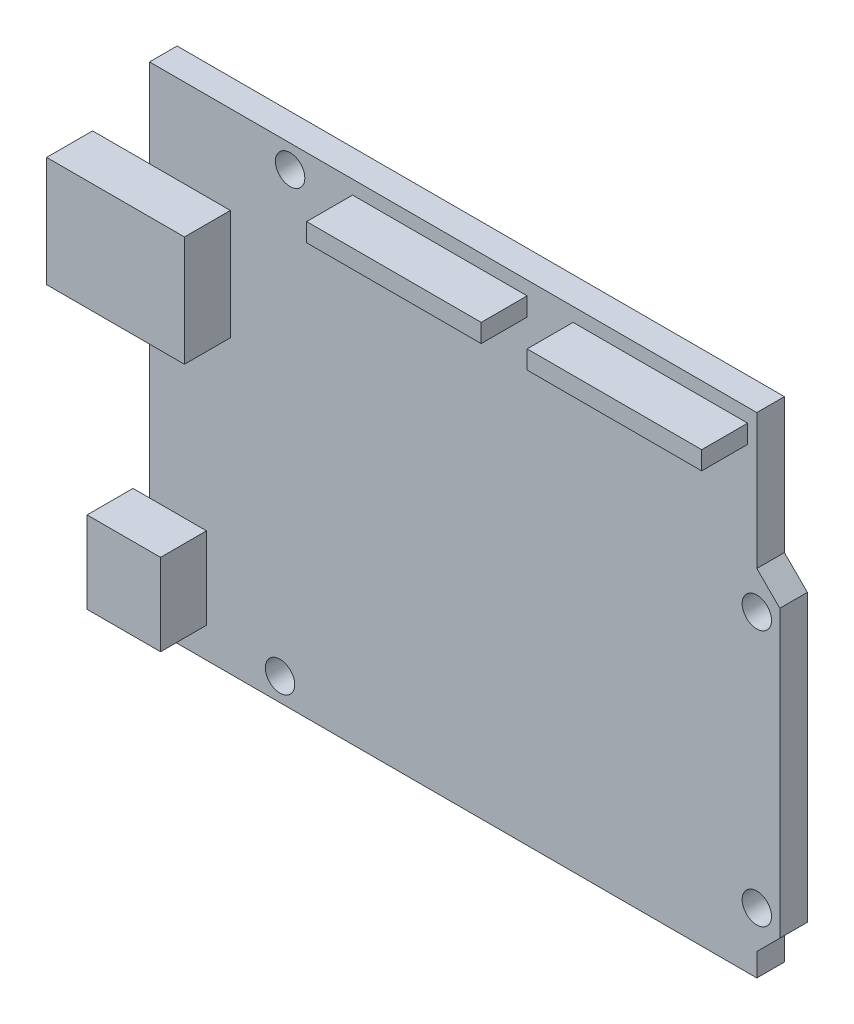
ISO-10303-21;
HEADER;
FILE_DESCRIPTION(('STEP AP214'),'2;1');
FILE_NAME('part.step','',(''),(''),'','','');
FILE_SCHEMA(('AUTOMOTIVE_DESIGN { 1 0 10303 214 1 1 1 1 }'));
ENDSEC;
DATA;
#1=APPLICATION_CONTEXT('core data for automotive mechanical design processes');
#2=APPLICATION_PROTOCOL_DEFINITION('international standard','automotive_design',2000,#1);
#3=PRODUCT_CONTEXT('',#1,'mechanical');
#4=PRODUCT('Part','Part','',(#3));
#5=PRODUCT_RELATED_PRODUCT_CATEGORY('part','',(#4));
#6=PRODUCT_DEFINITION_FORMATION('','',#4);
#7=PRODUCT_DEFINITION_CONTEXT('part definition',#1,'design');
#8=PRODUCT_DEFINITION('design','',#6,#7);
#9=PRODUCT_DEFINITION_SHAPE('','',#8);
#10=(LENGTH_UNIT() NAMED_UNIT(*) SI_UNIT(.MILLI.,.METRE.));
#11=(NAMED_UNIT(*) PLANE_ANGLE_UNIT() SI_UNIT($,.RADIAN.));
#12=(NAMED_UNIT(*) SI_UNIT($,.STERADIAN.) SOLID_ANGLE_UNIT());
#13=UNCERTAINTY_MEASURE_WITH_UNIT(LENGTH_MEASURE(1.E-05),#10,'distance_accuracy_value','');
#14=(GEOMETRIC_REPRESENTATION_CONTEXT(3) GLOBAL_UNCERTAINTY_ASSIGNED_CONTEXT((#13)) GLOBAL_UNIT_ASSIGNED_CONTEXT((#10,
#11,#12)) REPRESENTATION_CONTEXT('',''));
#15=CARTESIAN_POINT('',(0.,0.,0.));
#16=DIRECTION('',(0.,0.,1.));
#17=DIRECTION('',(1.,0.,0.));
#18=AXIS2_PLACEMENT_3D('',#15,#16,#17);
#19=CARTESIAN_POINT('',(0.,0.,3.));
#20=DIRECTION('',(0.,0.,1.));
#21=DIRECTION('',(1.,0.,0.));
#22=AXIS2_PLACEMENT_3D('',#19,#20,#21);
#23=PLANE('',#22);
#24=DIRECTION('',(0.,-1.,0.));
#25=VECTOR('',#24,1.);
#26=CARTESIAN_POINT('',(8.04999999999998,0.,3.));
#27=LINE('',#26,#25);
#28=CARTESIAN_POINT('',(8.04999999999998,25.15,3.));
#29=VERTEX_POINT('',#28);
#30=CARTESIAN_POINT('',(8.04999999999998,23.15,3.));
#31=VERTEX_POINT('',#30);
#32=EDGE_CURVE('E232',#29,#31,#27,.T.);
#33=ORIENTED_EDGE('',*,*,#32,.T.);
#34=DIRECTION('',(1.,0.,0.));
#35=VECTOR('',#34,1.);
#36=CARTESIAN_POINT('',(0.,23.15,3.));
#37=LINE('',#36,#35);
#38=CARTESIAN_POINT('',(-10.95,23.15,3.));
#39=VERTEX_POINT('',#38);
#40=EDGE_CURVE('E248',#39,#31,#37,.T.);
#41=ORIENTED_EDGE('',*,*,#40,.F.);
#42=DIRECTION('',(0.,-1.,0.));
#43=VECTOR('',#42,1.);
#44=CARTESIAN_POINT('',(-10.95,0.,3.));
#45=LINE('',#44,#43);
#46=CARTESIAN_POINT('',(-10.95,25.15,3.));
#47=VERTEX_POINT('',#46);
#48=EDGE_CURVE('E266',#47,#39,#45,.T.);
#49=ORIENTED_EDGE('',*,*,#48,.F.);
#50=DIRECTION('',(1.,0.,0.));
#51=VECTOR('',#50,1.);
#52=CARTESIAN_POINT('',(0.,25.15,3.));
#53=LINE('',#52,#51);
#54=EDGE_CURVE('E263',#47,#29,#53,.T.);
#55=ORIENTED_EDGE('',*,*,#54,.T.);
#56=EDGE_LOOP('',(#33,#41,#49,#55));
#57=FACE_BOUND('',#56,.T.);
#58=DIRECTION('',(0.,-1.,0.));
#59=VECTOR('',#58,1.);
#60=CARTESIAN_POINT('',(32.05,0.,3.));
#61=LINE('',#60,#59);
#62=CARTESIAN_POINT('',(32.05,25.15,3.));
#63=VERTEX_POINT('',#62);
#64=CARTESIAN_POINT('',(32.05,23.15,3.));
#65=VERTEX_POINT('',#64);
#66=EDGE_CURVE('E238',#63,#65,#61,.T.);
#67=ORIENTED_EDGE('',*,*,#66,.T.);
#68=DIRECTION('',(1.,0.,0.));
#69=VECTOR('',#68,1.);
#70=CARTESIAN_POINT('',(0.,23.15,3.));
#71=LINE('',#70,#69);
#72=CARTESIAN_POINT('',(13.05,23.15,3.));
#73=VERTEX_POINT('',#72);
#74=EDGE_CURVE('E282',#73,#65,#71,.T.);
#75=ORIENTED_EDGE('',*,*,#74,.F.);
#76=DIRECTION('',(0.,-1.,0.));
#77=VECTOR('',#76,1.);
#78=CARTESIAN_POINT('',(13.05,0.,3.));
#79=LINE('',#78,#77);
#80=CARTESIAN_POINT('',(13.05,25.15,3.));
#81=VERTEX_POINT('',#80);
#82=EDGE_CURVE('E300',#81,#73,#79,.T.);
#83=ORIENTED_EDGE('',*,*,#82,.F.);
#84=DIRECTION('',(1.,0.,0.));
#85=VECTOR('',#84,1.);
#86=CARTESIAN_POINT('',(0.,25.15,3.));
#87=LINE('',#86,#85);
#88=EDGE_CURVE('E296',#81,#63,#87,.T.);
#89=ORIENTED_EDGE('',*,*,#88,.T.);
#90=EDGE_LOOP('',(#67,#75,#83,#89));
#91=FACE_BOUND('',#90,.T.);
#92=DIRECTION('',(1.,0.,0.));
#93=VECTOR('',#92,1.);
#94=CARTESIAN_POINT('',(0.,-14.45,3.));
#95=LINE('',#94,#93);
#96=CARTESIAN_POINT('',(-33.05,-14.45,3.));
#97=VERTEX_POINT('',#96);
#98=CARTESIAN_POINT('',(-26.85,-14.45,3.));
#99=VERTEX_POINT('',#98);
#100=EDGE_CURVE('E334',#97,#99,#95,.T.);
#101=ORIENTED_EDGE('',*,*,#100,.T.);
#102=DIRECTION('',(0.,-1.,0.));
#103=VECTOR('',#102,1.);
#104=CARTESIAN_POINT('',(-26.85,0.,3.));
#105=LINE('',#104,#103);
#106=CARTESIAN_POINT('',(-26.85,-23.35,3.));
#107=VERTEX_POINT('',#106);
#108=EDGE_CURVE('E315',#99,#107,#105,.T.);
#109=ORIENTED_EDGE('',*,*,#108,.T.);
#110=DIRECTION('',(1.,0.,0.));
#111=VECTOR('',#110,1.);
#112=CARTESIAN_POINT('',(0.,-23.35,3.));
#113=LINE('',#112,#111);
#114=CARTESIAN_POINT('',(-33.05,-23.35,3.));
#115=VERTEX_POINT('',#114);
#116=EDGE_CURVE('E342',#115,#107,#113,.T.);
#117=ORIENTED_EDGE('',*,*,#116,.F.);
#118=DIRECTION('',(0.,-1.,0.));
#119=VECTOR('',#118,1.);
#120=CARTESIAN_POINT('',(-33.05,26.65,3.));
#121=LINE('',#120,#119);
#122=CARTESIAN_POINT('',(-33.05,-26.65,3.));
#123=VERTEX_POINT('',#122);
#124=EDGE_CURVE('E439',#115,#123,#121,.T.);
#125=ORIENTED_EDGE('',*,*,#124,.T.);
#126=DIRECTION('',(1.,0.,0.));
#127=VECTOR('',#126,1.);
#128=CARTESIAN_POINT('',(-33.05,-26.65,3.));
#129=LINE('',#128,#127);
#130=CARTESIAN_POINT('',(33.05,-26.65,3.));
#131=VERTEX_POINT('',#130);
#132=EDGE_CURVE('E445',#123,#131,#129,.T.);
#133=ORIENTED_EDGE('',*,*,#132,.T.);
#134=DIRECTION('',(0.,1.,0.));
#135=VECTOR('',#134,1.);
#136=CARTESIAN_POINT('',(33.05,-26.65,3.));
#137=LINE('',#136,#135);
#138=CARTESIAN_POINT('',(33.05,-24.15,3.));
#139=VERTEX_POINT('',#138);
#140=EDGE_CURVE('E449',#131,#139,#137,.T.);
#141=ORIENTED_EDGE('',*,*,#140,.T.);
#142=DIRECTION('',(0.707106781186547,0.707106781186548,0.));
#143=VECTOR('',#142,1.);
#144=CARTESIAN_POINT('',(33.05,-24.15,3.));
#145=LINE('',#144,#143);
#146=CARTESIAN_POINT('',(35.55,-21.65,3.));
#147=VERTEX_POINT('',#146);
#148=EDGE_CURVE('E452',#139,#147,#145,.T.);
#149=ORIENTED_EDGE('',*,*,#148,.T.);
#150=DIRECTION('',(0.,1.,0.));
#151=VECTOR('',#150,1.);
#152=CARTESIAN_POINT('',(35.55,-21.65,3.));
#153=LINE('',#152,#151);
#154=CARTESIAN_POINT('',(35.55,9.45,3.));
#155=VERTEX_POINT('',#154);
#156=EDGE_CURVE('E455',#147,#155,#153,.T.);
#157=ORIENTED_EDGE('',*,*,#156,.T.);
#158=DIRECTION('',(-0.707106781186549,0.707106781186546,0.));
#159=VECTOR('',#158,1.);
#160=CARTESIAN_POINT('',(35.55,9.45,3.));
#161=LINE('',#160,#159);
#162=CARTESIAN_POINT('',(33.05,11.95,3.));
#163=VERTEX_POINT('',#162);
#164=EDGE_CURVE('E458',#155,#163,#161,.T.);
#165=ORIENTED_EDGE('',*,*,#164,.T.);
#166=DIRECTION('',(0.,1.,0.));
#167=VECTOR('',#166,1.);
#168=CARTESIAN_POINT('',(33.05,11.95,3.));
#169=LINE('',#168,#167);
#170=CARTESIAN_POINT('',(33.05,26.65,3.));
#171=VERTEX_POINT('',#170);
#172=EDGE_CURVE('E461',#163,#171,#169,.T.);
#173=ORIENTED_EDGE('',*,*,#172,.T.);
#174=DIRECTION('',(-1.,0.,0.));
#175=VECTOR('',#174,1.);
#176=CARTESIAN_POINT('',(33.05,26.65,3.));
#177=LINE('',#176,#175);
#178=CARTESIAN_POINT('',(-33.05,26.65,3.));
#179=VERTEX_POINT('',#178);
#180=EDGE_CURVE('E435',#171,#179,#177,.T.);
#181=ORIENTED_EDGE('',*,*,#180,.T.);
#182=CARTESIAN_POINT('',(-33.05,17.05,3.));
#183=VERTEX_POINT('',#182);
#184=EDGE_CURVE('E441',#179,#183,#121,.T.);
#185=ORIENTED_EDGE('',*,*,#184,.T.);
#186=DIRECTION('',(1.,0.,0.));
#187=VECTOR('',#186,1.);
#188=CARTESIAN_POINT('',(0.,17.05,3.));
#189=LINE('',#188,#187);
#190=CARTESIAN_POINT('',(-24.25,17.05,3.));
#191=VERTEX_POINT('',#190);
#192=EDGE_CURVE('E57',#183,#191,#189,.T.);
#193=ORIENTED_EDGE('',*,*,#192,.T.);
#194=DIRECTION('',(0.,-1.,0.));
#195=VECTOR('',#194,1.);
#196=CARTESIAN_POINT('',(-24.25,0.,3.));
#197=LINE('',#196,#195);
#198=CARTESIAN_POINT('',(-24.25,5.04999999999999,3.));
#199=VERTEX_POINT('',#198);
#200=EDGE_CURVE('E360',#191,#199,#197,.T.);
#201=ORIENTED_EDGE('',*,*,#200,.T.);
#202=DIRECTION('',(1.,0.,0.));
#203=VECTOR('',#202,1.);
#204=CARTESIAN_POINT('',(0.,5.04999999999999,3.));
#205=LINE('',#204,#203);
#206=CARTESIAN_POINT('',(-33.05,5.04999999999999,3.));
#207=VERTEX_POINT('',#206);
#208=EDGE_CURVE('E11',#207,#199,#205,.T.);
#209=ORIENTED_EDGE('',*,*,#208,.F.);
#210=EDGE_CURVE('E537',#207,#97,#121,.T.);
#211=ORIENTED_EDGE('',*,*,#210,.T.);
#212=EDGE_LOOP('',(#101,#109,#117,#125,#133,#141,#149,#157,#165,#173,#181,#185,#193,#201,#209,#211));
#213=FACE_BOUND('',#212,.T.);
#214=CARTESIAN_POINT('',(-18.85,-24.15,3.));
#215=DIRECTION('',(0.,0.,1.));
#216=DIRECTION('',(1.,0.,0.));
#217=AXIS2_PLACEMENT_3D('',#214,#215,#216);
#218=CIRCLE('',#217,1.6);
#219=CARTESIAN_POINT('',(-17.25,-24.15,3.));
#220=VERTEX_POINT('',#219);
#221=EDGE_CURVE('E411',#220,#220,#218,.T.);
#222=ORIENTED_EDGE('',*,*,#221,.F.);
#223=EDGE_LOOP('',(#222));
#224=FACE_BOUND('',#223,.T.);
#225=CARTESIAN_POINT('',(33.05,-20.05,3.));
#226=DIRECTION('',(0.,0.,1.));
#227=DIRECTION('',(1.,0.,0.));
#228=AXIS2_PLACEMENT_3D('',#225,#226,#227);
#229=CIRCLE('',#228,1.6);
#230=CARTESIAN_POINT('',(34.65,-20.05,3.));
#231=VERTEX_POINT('',#230);
#232=EDGE_CURVE('E427',#231,#231,#229,.T.);
#233=ORIENTED_EDGE('',*,*,#232,.F.);
#234=EDGE_LOOP('',(#233));
#235=FACE_BOUND('',#234,.T.);
#236=CARTESIAN_POINT('',(33.05,7.85,3.));
#237=DIRECTION('',(0.,0.,1.));
#238=DIRECTION('',(1.,0.,0.));
#239=AXIS2_PLACEMENT_3D('',#236,#237,#238);
#240=CIRCLE('',#239,1.6);
#241=CARTESIAN_POINT('',(34.65,7.85,3.));
#242=VERTEX_POINT('',#241);
#243=EDGE_CURVE('E419',#242,#242,#240,.T.);
#244=ORIENTED_EDGE('',*,*,#243,.F.);
#245=EDGE_LOOP('',(#244));
#246=FACE_BOUND('',#245,.T.);
#247=CARTESIAN_POINT('',(-17.75,24.15,3.));
#248=DIRECTION('',(0.,0.,1.));
#249=DIRECTION('',(1.,0.,0.));
#250=AXIS2_PLACEMENT_3D('',#247,#248,#249);
#251=CIRCLE('',#250,1.6);
#252=CARTESIAN_POINT('',(-16.15,24.15,3.));
#253=VERTEX_POINT('',#252);
#254=EDGE_CURVE('E403',#253,#253,#251,.T.);
#255=ORIENTED_EDGE('',*,*,#254,.F.);
#256=EDGE_LOOP('',(#255));
#257=FACE_BOUND('',#256,.T.);
#258=ADVANCED_FACE('F47',(#57,#91,#213,#224,#235,#246,#257),#23,.T.);
#259=CARTESIAN_POINT('',(0.,0.,0.));
#260=DIRECTION('',(0.,0.,1.));
#261=DIRECTION('',(1.,0.,0.));
#262=AXIS2_PLACEMENT_3D('',#259,#260,#261);
#263=PLANE('',#262);
#264=DIRECTION('',(-1.,0.,0.));
#265=VECTOR('',#264,1.);
#266=CARTESIAN_POINT('',(33.05,26.65,0.));
#267=LINE('',#266,#265);
#268=CARTESIAN_POINT('',(33.05,26.65,0.));
#269=VERTEX_POINT('',#268);
#270=CARTESIAN_POINT('',(-33.05,26.65,0.));
#271=VERTEX_POINT('',#270);
#272=EDGE_CURVE('E431',#269,#271,#267,.T.);
#273=ORIENTED_EDGE('',*,*,#272,.F.);
#274=DIRECTION('',(0.,1.,0.));
#275=VECTOR('',#274,1.);
#276=CARTESIAN_POINT('',(33.05,11.95,0.));
#277=LINE('',#276,#275);
#278=CARTESIAN_POINT('',(33.05,11.95,0.));
#279=VERTEX_POINT('',#278);
#280=EDGE_CURVE('E440',#279,#269,#277,.T.);
#281=ORIENTED_EDGE('',*,*,#280,.F.);
#282=DIRECTION('',(-0.707106781186549,0.707106781186546,0.));
#283=VECTOR('',#282,1.);
#284=CARTESIAN_POINT('',(35.55,9.45,0.));
#285=LINE('',#284,#283);
#286=CARTESIAN_POINT('',(35.55,9.45,0.));
#287=VERTEX_POINT('',#286);
#288=EDGE_CURVE('E483',#287,#279,#285,.T.);
#289=ORIENTED_EDGE('',*,*,#288,.F.);
#290=DIRECTION('',(0.,1.,0.));
#291=VECTOR('',#290,1.);
#292=CARTESIAN_POINT('',(35.55,-21.65,0.));
#293=LINE('',#292,#291);
#294=CARTESIAN_POINT('',(35.55,-21.65,0.));
#295=VERTEX_POINT('',#294);
#296=EDGE_CURVE('E480',#295,#287,#293,.T.);
#297=ORIENTED_EDGE('',*,*,#296,.F.);
#298=DIRECTION('',(0.707106781186547,0.707106781186548,0.));
#299=VECTOR('',#298,1.);
#300=CARTESIAN_POINT('',(33.05,-24.15,0.));
#301=LINE('',#300,#299);
#302=CARTESIAN_POINT('',(33.05,-24.15,0.));
#303=VERTEX_POINT('',#302);
#304=EDGE_CURVE('E477',#303,#295,#301,.T.);
#305=ORIENTED_EDGE('',*,*,#304,.F.);
#306=DIRECTION('',(0.,1.,0.));
#307=VECTOR('',#306,1.);
#308=CARTESIAN_POINT('',(33.05,-26.65,0.));
#309=LINE('',#308,#307);
#310=CARTESIAN_POINT('',(33.05,-26.65,0.));
#311=VERTEX_POINT('',#310);
#312=EDGE_CURVE('E474',#311,#303,#309,.T.);
#313=ORIENTED_EDGE('',*,*,#312,.F.);
#314=DIRECTION('',(1.,0.,0.));
#315=VECTOR('',#314,1.);
#316=CARTESIAN_POINT('',(-33.05,-26.65,0.));
#317=LINE('',#316,#315);
#318=CARTESIAN_POINT('',(-33.05,-26.65,0.));
#319=VERTEX_POINT('',#318);
#320=EDGE_CURVE('E471',#319,#311,#317,.T.);
#321=ORIENTED_EDGE('',*,*,#320,.F.);
#322=DIRECTION('',(0.,-1.,0.));
#323=VECTOR('',#322,1.);
#324=CARTESIAN_POINT('',(-33.05,26.65,0.));
#325=LINE('',#324,#323);
#326=EDGE_CURVE('E468',#271,#319,#325,.T.);
#327=ORIENTED_EDGE('',*,*,#326,.F.);
#328=EDGE_LOOP('',(#273,#281,#289,#297,#305,#313,#321,#327));
#329=FACE_BOUND('',#328,.T.);
#330=CARTESIAN_POINT('',(33.05,-20.05,0.));
#331=DIRECTION('',(0.,0.,1.));
#332=DIRECTION('',(1.,0.,0.));
#333=AXIS2_PLACEMENT_3D('',#330,#331,#332);
#334=CIRCLE('',#333,1.6);
#335=CARTESIAN_POINT('',(34.65,-20.05,0.));
#336=VERTEX_POINT('',#335);
#337=EDGE_CURVE('E423',#336,#336,#334,.T.);
#338=ORIENTED_EDGE('',*,*,#337,.T.);
#339=EDGE_LOOP('',(#338));
#340=FACE_BOUND('',#339,.T.);
#341=CARTESIAN_POINT('',(33.05,7.85,0.));
#342=DIRECTION('',(0.,0.,1.));
#343=DIRECTION('',(1.,0.,0.));
#344=AXIS2_PLACEMENT_3D('',#341,#342,#343);
#345=CIRCLE('',#344,1.6);
#346=CARTESIAN_POINT('',(34.65,7.85,0.));
#347=VERTEX_POINT('',#346);
#348=EDGE_CURVE('E415',#347,#347,#345,.T.);
#349=ORIENTED_EDGE('',*,*,#348,.T.);
#350=EDGE_LOOP('',(#349));
#351=FACE_BOUND('',#350,.T.);
#352=CARTESIAN_POINT('',(-18.85,-24.15,0.));
#353=DIRECTION('',(0.,0.,1.));
#354=DIRECTION('',(1.,0.,0.));
#355=AXIS2_PLACEMENT_3D('',#352,#353,#354);
#356=CIRCLE('',#355,1.6);
#357=CARTESIAN_POINT('',(-17.25,-24.15,0.));
#358=VERTEX_POINT('',#357);
#359=EDGE_CURVE('E407',#358,#358,#356,.T.);
#360=ORIENTED_EDGE('',*,*,#359,.T.);
#361=EDGE_LOOP('',(#360));
#362=FACE_BOUND('',#361,.T.);
#363=CARTESIAN_POINT('',(-17.75,24.15,0.));
#364=DIRECTION('',(0.,0.,1.));
#365=DIRECTION('',(1.,0.,0.));
#366=AXIS2_PLACEMENT_3D('',#363,#364,#365);
#367=CIRCLE('',#366,1.6);
#368=CARTESIAN_POINT('',(-16.15,24.15,0.));
#369=VERTEX_POINT('',#368);
#370=EDGE_CURVE('E402',#369,#369,#367,.T.);
#371=ORIENTED_EDGE('',*,*,#370,.T.);
#372=EDGE_LOOP('',(#371));
#373=FACE_BOUND('',#372,.T.);
#374=ADVANCED_FACE('F580',(#329,#340,#351,#362,#373),#263,.F.);
#375=CARTESIAN_POINT('',(33.05,26.65,3.));
#376=DIRECTION('',(0.,-1.,0.));
#377=DIRECTION('',(0.,0.,-1.));
#378=AXIS2_PLACEMENT_3D('',#375,#376,#377);
#379=PLANE('',#378);
#380=ORIENTED_EDGE('',*,*,#272,.T.);
#381=DIRECTION('',(0.,0.,-1.));
#382=VECTOR('',#381,1.);
#383=CARTESIAN_POINT('',(-33.05,26.65,3.));
#384=LINE('',#383,#382);
#385=EDGE_CURVE('E51',#179,#271,#384,.T.);
#386=ORIENTED_EDGE('',*,*,#385,.F.);
#387=ORIENTED_EDGE('',*,*,#180,.F.);
#388=DIRECTION('',(0.,0.,-1.));
#389=VECTOR('',#388,1.);
#390=CARTESIAN_POINT('',(33.05,26.65,3.));
#391=LINE('',#390,#389);
#392=EDGE_CURVE('E464',#171,#269,#391,.T.);
#393=ORIENTED_EDGE('',*,*,#392,.T.);
#394=EDGE_LOOP('',(#380,#386,#387,#393));
#395=FACE_BOUND('',#394,.T.);
#396=ADVANCED_FACE('F49',(#395),#379,.F.);
#397=CARTESIAN_POINT('',(-33.05,26.65,3.));
#398=DIRECTION('',(1.,0.,0.));
#399=DIRECTION('',(0.,0.,-1.));
#400=AXIS2_PLACEMENT_3D('',#397,#398,#399);
#401=PLANE('',#400);
#402=ORIENTED_EDGE('',*,*,#326,.T.);
#403=DIRECTION('',(0.,0.,-1.));
#404=VECTOR('',#403,1.);
#405=CARTESIAN_POINT('',(-33.05,-26.65,3.));
#406=LINE('',#405,#404);
#407=EDGE_CURVE('E510',#123,#319,#406,.T.);
#408=ORIENTED_EDGE('',*,*,#407,.F.);
#409=ORIENTED_EDGE('',*,*,#124,.F.);
#410=EDGE_CURVE('E540',#97,#115,#121,.T.);
#411=ORIENTED_EDGE('',*,*,#410,.F.);
#412=ORIENTED_EDGE('',*,*,#210,.F.);
#413=EDGE_CURVE('E446',#183,#207,#121,.T.);
#414=ORIENTED_EDGE('',*,*,#413,.F.);
#415=ORIENTED_EDGE('',*,*,#184,.F.);
#416=ORIENTED_EDGE('',*,*,#385,.T.);
#417=EDGE_LOOP('',(#402,#408,#409,#411,#412,#414,#415,#416));
#418=FACE_BOUND('',#417,.T.);
#419=ADVANCED_FACE('F535',(#418),#401,.F.);
#420=CARTESIAN_POINT('',(-33.05,-26.65,3.));
#421=DIRECTION('',(0.,1.,0.));
#422=DIRECTION('',(0.,0.,1.));
#423=AXIS2_PLACEMENT_3D('',#420,#421,#422);
#424=PLANE('',#423);
#425=ORIENTED_EDGE('',*,*,#320,.T.);
#426=DIRECTION('',(0.,0.,-1.));
#427=VECTOR('',#426,1.);
#428=CARTESIAN_POINT('',(33.05,-26.65,3.));
#429=LINE('',#428,#427);
#430=EDGE_CURVE('E507',#131,#311,#429,.T.);
#431=ORIENTED_EDGE('',*,*,#430,.F.);
#432=ORIENTED_EDGE('',*,*,#132,.F.);
#433=ORIENTED_EDGE('',*,*,#407,.T.);
#434=EDGE_LOOP('',(#425,#431,#432,#433));
#435=FACE_BOUND('',#434,.T.);
#436=ADVANCED_FACE('F550',(#435),#424,.F.);
#437=CARTESIAN_POINT('',(33.05,-26.65,3.));
#438=DIRECTION('',(-1.,0.,0.));
#439=DIRECTION('',(0.,-1.,0.));
#440=AXIS2_PLACEMENT_3D('',#437,#438,#439);
#441=PLANE('',#440);
#442=ORIENTED_EDGE('',*,*,#312,.T.);
#443=DIRECTION('',(0.,0.,-1.));
#444=VECTOR('',#443,1.);
#445=CARTESIAN_POINT('',(33.05,-24.15,3.));
#446=LINE('',#445,#444);
#447=EDGE_CURVE('E503',#139,#303,#446,.T.);
#448=ORIENTED_EDGE('',*,*,#447,.F.);
#449=ORIENTED_EDGE('',*,*,#140,.F.);
#450=ORIENTED_EDGE('',*,*,#430,.T.);
#451=EDGE_LOOP('',(#442,#448,#449,#450));
#452=FACE_BOUND('',#451,.T.);
#453=ADVANCED_FACE('F555',(#452),#441,.F.);
#454=CARTESIAN_POINT('',(33.05,-24.15,3.));
#455=DIRECTION('',(-0.707106781186548,0.707106781186547,0.));
#456=DIRECTION('',(-0.707106781186547,-0.707106781186548,0.));
#457=AXIS2_PLACEMENT_3D('',#454,#455,#456);
#458=PLANE('',#457);
#459=ORIENTED_EDGE('',*,*,#304,.T.);
#460=DIRECTION('',(0.,0.,-1.));
#461=VECTOR('',#460,1.);
#462=CARTESIAN_POINT('',(35.55,-21.65,3.));
#463=LINE('',#462,#461);
#464=EDGE_CURVE('E499',#147,#295,#463,.T.);
#465=ORIENTED_EDGE('',*,*,#464,.F.);
#466=ORIENTED_EDGE('',*,*,#148,.F.);
#467=ORIENTED_EDGE('',*,*,#447,.T.);
#468=EDGE_LOOP('',(#459,#465,#466,#467));
#469=FACE_BOUND('',#468,.T.);
#470=ADVANCED_FACE('F561',(#469),#458,.F.);
#471=CARTESIAN_POINT('',(35.55,-21.65,3.));
#472=DIRECTION('',(-1.,0.,0.));
#473=DIRECTION('',(0.,0.,1.));
#474=AXIS2_PLACEMENT_3D('',#471,#472,#473);
#475=PLANE('',#474);
#476=ORIENTED_EDGE('',*,*,#296,.T.);
#477=DIRECTION('',(0.,0.,-1.));
#478=VECTOR('',#477,1.);
#479=CARTESIAN_POINT('',(35.55,9.45,3.));
#480=LINE('',#479,#478);
#481=EDGE_CURVE('E495',#155,#287,#480,.T.);
#482=ORIENTED_EDGE('',*,*,#481,.F.);
#483=ORIENTED_EDGE('',*,*,#156,.F.);
#484=ORIENTED_EDGE('',*,*,#464,.T.);
#485=EDGE_LOOP('',(#476,#482,#483,#484));
#486=FACE_BOUND('',#485,.T.);
#487=ADVANCED_FACE('F565',(#486),#475,.F.);
#488=CARTESIAN_POINT('',(35.55,9.45,3.));
#489=DIRECTION('',(-0.707106781186546,-0.707106781186549,0.));
#490=DIRECTION('',(0.707106781186549,-0.707106781186546,0.));
#491=AXIS2_PLACEMENT_3D('',#488,#489,#490);
#492=PLANE('',#491);
#493=ORIENTED_EDGE('',*,*,#288,.T.);
#494=DIRECTION('',(0.,0.,-1.));
#495=VECTOR('',#494,1.);
#496=CARTESIAN_POINT('',(33.05,11.95,3.));
#497=LINE('',#496,#495);
#498=EDGE_CURVE('E491',#163,#279,#497,.T.);
#499=ORIENTED_EDGE('',*,*,#498,.F.);
#500=ORIENTED_EDGE('',*,*,#164,.F.);
#501=ORIENTED_EDGE('',*,*,#481,.T.);
#502=EDGE_LOOP('',(#493,#499,#500,#501));
#503=FACE_BOUND('',#502,.T.);
#504=ADVANCED_FACE('F570',(#503),#492,.F.);
#505=CARTESIAN_POINT('',(33.05,11.95,3.));
#506=DIRECTION('',(-1.,0.,0.));
#507=DIRECTION('',(0.,-1.,0.));
#508=AXIS2_PLACEMENT_3D('',#505,#506,#507);
#509=PLANE('',#508);
#510=ORIENTED_EDGE('',*,*,#280,.T.);
#511=ORIENTED_EDGE('',*,*,#392,.F.);
#512=ORIENTED_EDGE('',*,*,#172,.F.);
#513=ORIENTED_EDGE('',*,*,#498,.T.);
#514=EDGE_LOOP('',(#510,#511,#512,#513));
#515=FACE_BOUND('',#514,.T.);
#516=ADVANCED_FACE('F575',(#515),#509,.F.);
#517=CARTESIAN_POINT('',(33.05,-20.05,3.));
#518=DIRECTION('',(0.,0.,-1.));
#519=DIRECTION('',(-1.,0.,0.));
#520=AXIS2_PLACEMENT_3D('',#517,#518,#519);
#521=CYLINDRICAL_SURFACE('',#520,1.6);
#522=ORIENTED_EDGE('',*,*,#232,.T.);
#523=EDGE_LOOP('',(#522));
#524=FACE_BOUND('',#523,.T.);
#525=ORIENTED_EDGE('',*,*,#337,.F.);
#526=EDGE_LOOP('',(#525));
#527=FACE_BOUND('',#526,.T.);
#528=ADVANCED_FACE('F615',(#524,#527),#521,.F.);
#529=CARTESIAN_POINT('',(33.05,7.85,3.));
#530=DIRECTION('',(0.,0.,-1.));
#531=DIRECTION('',(-1.,0.,0.));
#532=AXIS2_PLACEMENT_3D('',#529,#530,#531);
#533=CYLINDRICAL_SURFACE('',#532,1.6);
#534=ORIENTED_EDGE('',*,*,#243,.T.);
#535=EDGE_LOOP('',(#534));
#536=FACE_BOUND('',#535,.T.);
#537=ORIENTED_EDGE('',*,*,#348,.F.);
#538=EDGE_LOOP('',(#537));
#539=FACE_BOUND('',#538,.T.);
#540=ADVANCED_FACE('F604',(#536,#539),#533,.F.);
#541=CARTESIAN_POINT('',(-18.85,-24.15,3.));
#542=DIRECTION('',(0.,0.,-1.));
#543=DIRECTION('',(-1.,0.,0.));
#544=AXIS2_PLACEMENT_3D('',#541,#542,#543);
#545=CYLINDRICAL_SURFACE('',#544,1.6);
#546=ORIENTED_EDGE('',*,*,#221,.T.);
#547=EDGE_LOOP('',(#546));
#548=FACE_BOUND('',#547,.T.);
#549=ORIENTED_EDGE('',*,*,#359,.F.);
#550=EDGE_LOOP('',(#549));
#551=FACE_BOUND('',#550,.T.);
#552=ADVANCED_FACE('F594',(#548,#551),#545,.F.);
#553=CARTESIAN_POINT('',(-17.75,24.15,3.));
#554=DIRECTION('',(0.,0.,-1.));
#555=DIRECTION('',(-1.,0.,0.));
#556=AXIS2_PLACEMENT_3D('',#553,#554,#555);
#557=CYLINDRICAL_SURFACE('',#556,1.6);
#558=ORIENTED_EDGE('',*,*,#254,.T.);
#559=EDGE_LOOP('',(#558));
#560=FACE_BOUND('',#559,.T.);
#561=ORIENTED_EDGE('',*,*,#370,.F.);
#562=EDGE_LOOP('',(#561));
#563=FACE_BOUND('',#562,.T.);
#564=ADVANCED_FACE('F592',(#560,#563),#557,.F.);
#565=CARTESIAN_POINT('',(0.,0.,3.));
#566=DIRECTION('',(0.,0.,1.));
#567=DIRECTION('',(1.,0.,0.));
#568=AXIS2_PLACEMENT_3D('',#565,#566,#567);
#569=PLANE('',#568);
#570=CARTESIAN_POINT('',(-39.25,17.05,3.));
#571=VERTEX_POINT('',#570);
#572=EDGE_CURVE('E379',#571,#183,#189,.T.);
#573=ORIENTED_EDGE('',*,*,#572,.T.);
#574=ORIENTED_EDGE('',*,*,#413,.T.);
#575=CARTESIAN_POINT('',(-39.25,5.04999999999999,3.));
#576=VERTEX_POINT('',#575);
#577=EDGE_CURVE('E59',#576,#207,#205,.T.);
#578=ORIENTED_EDGE('',*,*,#577,.F.);
#579=DIRECTION('',(0.,-1.,0.));
#580=VECTOR('',#579,1.);
#581=CARTESIAN_POINT('',(-39.25,0.,3.));
#582=LINE('',#581,#580);
#583=EDGE_CURVE('E383',#571,#576,#582,.T.);
#584=ORIENTED_EDGE('',*,*,#583,.F.);
#585=EDGE_LOOP('',(#573,#574,#578,#584));
#586=FACE_BOUND('',#585,.T.);
#587=ADVANCED_FACE('F532',(#586),#569,.F.);
#588=CARTESIAN_POINT('',(-24.25,0.,8.));
#589=DIRECTION('',(1.,0.,0.));
#590=DIRECTION('',(0.,0.,-1.));
#591=AXIS2_PLACEMENT_3D('',#588,#589,#590);
#592=PLANE('',#591);
#593=ORIENTED_EDGE('',*,*,#200,.F.);
#594=DIRECTION('',(0.,0.,-1.));
#595=VECTOR('',#594,1.);
#596=CARTESIAN_POINT('',(-24.25,17.05,8.));
#597=LINE('',#596,#595);
#598=CARTESIAN_POINT('',(-24.25,17.05,8.));
#599=VERTEX_POINT('',#598);
#600=EDGE_CURVE('E398',#599,#191,#597,.T.);
#601=ORIENTED_EDGE('',*,*,#600,.F.);
#602=DIRECTION('',(0.,-1.,0.));
#603=VECTOR('',#602,1.);
#604=CARTESIAN_POINT('',(-24.25,0.,8.));
#605=LINE('',#604,#603);
#606=CARTESIAN_POINT('',(-24.25,5.04999999999999,8.));
#607=VERTEX_POINT('',#606);
#608=EDGE_CURVE('E361',#599,#607,#605,.T.);
#609=ORIENTED_EDGE('',*,*,#608,.T.);
#610=DIRECTION('',(0.,0.,-1.));
#611=VECTOR('',#610,1.);
#612=CARTESIAN_POINT('',(-24.25,5.04999999999999,8.));
#613=LINE('',#612,#611);
#614=EDGE_CURVE('E375',#607,#199,#613,.T.);
#615=ORIENTED_EDGE('',*,*,#614,.T.);
#616=EDGE_LOOP('',(#593,#601,#609,#615));
#617=FACE_BOUND('',#616,.T.);
#618=ADVANCED_FACE('F602',(#617),#592,.T.);
#619=CARTESIAN_POINT('',(0.,17.05,8.));
#620=DIRECTION('',(0.,1.,0.));
#621=DIRECTION('',(0.,0.,1.));
#622=AXIS2_PLACEMENT_3D('',#619,#620,#621);
#623=PLANE('',#622);
#624=ORIENTED_EDGE('',*,*,#572,.F.);
#625=DIRECTION('',(0.,0.,-1.));
#626=VECTOR('',#625,1.);
#627=CARTESIAN_POINT('',(-39.25,17.05,8.));
#628=LINE('',#627,#626);
#629=CARTESIAN_POINT('',(-39.25,17.05,8.));
#630=VERTEX_POINT('',#629);
#631=EDGE_CURVE('E395',#630,#571,#628,.T.);
#632=ORIENTED_EDGE('',*,*,#631,.F.);
#633=DIRECTION('',(1.,0.,0.));
#634=VECTOR('',#633,1.);
#635=CARTESIAN_POINT('',(0.,17.05,8.));
#636=LINE('',#635,#634);
#637=EDGE_CURVE('E365',#630,#599,#636,.T.);
#638=ORIENTED_EDGE('',*,*,#637,.T.);
#639=ORIENTED_EDGE('',*,*,#600,.T.);
#640=ORIENTED_EDGE('',*,*,#192,.F.);
#641=EDGE_LOOP('',(#624,#632,#638,#639,#640));
#642=FACE_BOUND('',#641,.T.);
#643=ADVANCED_FACE('F528',(#642),#623,.T.);
#644=CARTESIAN_POINT('',(-39.25,0.,8.));
#645=DIRECTION('',(1.,0.,0.));
#646=DIRECTION('',(0.,0.,-1.));
#647=AXIS2_PLACEMENT_3D('',#644,#645,#646);
#648=PLANE('',#647);
#649=ORIENTED_EDGE('',*,*,#583,.T.);
#650=DIRECTION('',(0.,0.,-1.));
#651=VECTOR('',#650,1.);
#652=CARTESIAN_POINT('',(-39.25,5.04999999999999,8.));
#653=LINE('',#652,#651);
#654=CARTESIAN_POINT('',(-39.25,5.04999999999999,8.));
#655=VERTEX_POINT('',#654);
#656=EDGE_CURVE('E391',#655,#576,#653,.T.);
#657=ORIENTED_EDGE('',*,*,#656,.F.);
#658=DIRECTION('',(0.,-1.,0.));
#659=VECTOR('',#658,1.);
#660=CARTESIAN_POINT('',(-39.25,0.,8.));
#661=LINE('',#660,#659);
#662=EDGE_CURVE('E369',#630,#655,#661,.T.);
#663=ORIENTED_EDGE('',*,*,#662,.F.);
#664=ORIENTED_EDGE('',*,*,#631,.T.);
#665=EDGE_LOOP('',(#649,#657,#663,#664));
#666=FACE_BOUND('',#665,.T.);
#667=ADVANCED_FACE('F716',(#666),#648,.F.);
#668=CARTESIAN_POINT('',(0.,5.04999999999999,8.));
#669=DIRECTION('',(0.,1.,0.));
#670=DIRECTION('',(0.,0.,1.));
#671=AXIS2_PLACEMENT_3D('',#668,#669,#670);
#672=PLANE('',#671);
#673=ORIENTED_EDGE('',*,*,#577,.T.);
#674=ORIENTED_EDGE('',*,*,#208,.T.);
#675=ORIENTED_EDGE('',*,*,#614,.F.);
#676=DIRECTION('',(1.,0.,0.));
#677=VECTOR('',#676,1.);
#678=CARTESIAN_POINT('',(0.,5.04999999999999,8.));
#679=LINE('',#678,#677);
#680=EDGE_CURVE('E372',#655,#607,#679,.T.);
#681=ORIENTED_EDGE('',*,*,#680,.F.);
#682=ORIENTED_EDGE('',*,*,#656,.T.);
#683=EDGE_LOOP('',(#673,#674,#675,#681,#682));
#684=FACE_BOUND('',#683,.T.);
#685=ADVANCED_FACE('F725',(#684),#672,.F.);
#686=CARTESIAN_POINT('',(0.,0.,8.));
#687=DIRECTION('',(0.,0.,1.));
#688=DIRECTION('',(1.,0.,0.));
#689=AXIS2_PLACEMENT_3D('',#686,#687,#688);
#690=PLANE('',#689);
#691=ORIENTED_EDGE('',*,*,#608,.F.);
#692=ORIENTED_EDGE('',*,*,#637,.F.);
#693=ORIENTED_EDGE('',*,*,#662,.T.);
#694=ORIENTED_EDGE('',*,*,#680,.T.);
#695=EDGE_LOOP('',(#691,#692,#693,#694));
#696=FACE_BOUND('',#695,.T.);
#697=ADVANCED_FACE('F735',(#696),#690,.T.);
#698=CARTESIAN_POINT('',(0.,0.,3.));
#699=DIRECTION('',(0.,0.,1.));
#700=DIRECTION('',(1.,0.,0.));
#701=AXIS2_PLACEMENT_3D('',#698,#699,#700);
#702=PLANE('',#701);
#703=CARTESIAN_POINT('',(-34.85,-14.45,3.));
#704=VERTEX_POINT('',#703);
#705=EDGE_CURVE('E335',#704,#97,#95,.T.);
#706=ORIENTED_EDGE('',*,*,#705,.T.);
#707=ORIENTED_EDGE('',*,*,#410,.T.);
#708=CARTESIAN_POINT('',(-34.85,-23.35,3.));
#709=VERTEX_POINT('',#708);
#710=EDGE_CURVE('E321',#709,#115,#113,.T.);
#711=ORIENTED_EDGE('',*,*,#710,.F.);
#712=DIRECTION('',(0.,-1.,0.));
#713=VECTOR('',#712,1.);
#714=CARTESIAN_POINT('',(-34.85,0.,3.));
#715=LINE('',#714,#713);
#716=EDGE_CURVE('E339',#704,#709,#715,.T.);
#717=ORIENTED_EDGE('',*,*,#716,.F.);
#718=EDGE_LOOP('',(#706,#707,#711,#717));
#719=FACE_BOUND('',#718,.T.);
#720=ADVANCED_FACE('F745',(#719),#702,.F.);
#721=CARTESIAN_POINT('',(-26.85,0.,8.));
#722=DIRECTION('',(1.,0.,0.));
#723=DIRECTION('',(0.,0.,-1.));
#724=AXIS2_PLACEMENT_3D('',#721,#722,#723);
#725=PLANE('',#724);
#726=ORIENTED_EDGE('',*,*,#108,.F.);
#727=DIRECTION('',(0.,0.,-1.));
#728=VECTOR('',#727,1.);
#729=CARTESIAN_POINT('',(-26.85,-14.45,8.));
#730=LINE('',#729,#728);
#731=CARTESIAN_POINT('',(-26.85,-14.45,8.));
#732=VERTEX_POINT('',#731);
#733=EDGE_CURVE('E356',#732,#99,#730,.T.);
#734=ORIENTED_EDGE('',*,*,#733,.F.);
#735=DIRECTION('',(0.,-1.,0.));
#736=VECTOR('',#735,1.);
#737=CARTESIAN_POINT('',(-26.85,0.,8.));
#738=LINE('',#737,#736);
#739=CARTESIAN_POINT('',(-26.85,-23.35,8.));
#740=VERTEX_POINT('',#739);
#741=EDGE_CURVE('E316',#732,#740,#738,.T.);
#742=ORIENTED_EDGE('',*,*,#741,.T.);
#743=DIRECTION('',(0.,0.,-1.));
#744=VECTOR('',#743,1.);
#745=CARTESIAN_POINT('',(-26.85,-23.35,8.));
#746=LINE('',#745,#744);
#747=EDGE_CURVE('E331',#740,#107,#746,.T.);
#748=ORIENTED_EDGE('',*,*,#747,.T.);
#749=EDGE_LOOP('',(#726,#734,#742,#748));
#750=FACE_BOUND('',#749,.T.);
#751=ADVANCED_FACE('F758',(#750),#725,.T.);
#752=CARTESIAN_POINT('',(0.,-14.45,8.));
#753=DIRECTION('',(0.,1.,0.));
#754=DIRECTION('',(0.,0.,1.));
#755=AXIS2_PLACEMENT_3D('',#752,#753,#754);
#756=PLANE('',#755);
#757=ORIENTED_EDGE('',*,*,#705,.F.);
#758=DIRECTION('',(0.,0.,-1.));
#759=VECTOR('',#758,1.);
#760=CARTESIAN_POINT('',(-34.85,-14.45,8.));
#761=LINE('',#760,#759);
#762=CARTESIAN_POINT('',(-34.85,-14.45,8.));
#763=VERTEX_POINT('',#762);
#764=EDGE_CURVE('E353',#763,#704,#761,.T.);
#765=ORIENTED_EDGE('',*,*,#764,.F.);
#766=DIRECTION('',(1.,0.,0.));
#767=VECTOR('',#766,1.);
#768=CARTESIAN_POINT('',(0.,-14.45,8.));
#769=LINE('',#768,#767);
#770=EDGE_CURVE('E320',#763,#732,#769,.T.);
#771=ORIENTED_EDGE('',*,*,#770,.T.);
#772=ORIENTED_EDGE('',*,*,#733,.T.);
#773=ORIENTED_EDGE('',*,*,#100,.F.);
#774=EDGE_LOOP('',(#757,#765,#771,#772,#773));
#775=FACE_BOUND('',#774,.T.);
#776=ADVANCED_FACE('F770',(#775),#756,.T.);
#777=CARTESIAN_POINT('',(-34.85,0.,8.));
#778=DIRECTION('',(1.,0.,0.));
#779=DIRECTION('',(0.,0.,-1.));
#780=AXIS2_PLACEMENT_3D('',#777,#778,#779);
#781=PLANE('',#780);
#782=ORIENTED_EDGE('',*,*,#716,.T.);
#783=DIRECTION('',(0.,0.,-1.));
#784=VECTOR('',#783,1.);
#785=CARTESIAN_POINT('',(-34.85,-23.35,8.));
#786=LINE('',#785,#784);
#787=CARTESIAN_POINT('',(-34.85,-23.35,8.));
#788=VERTEX_POINT('',#787);
#789=EDGE_CURVE('E349',#788,#709,#786,.T.);
#790=ORIENTED_EDGE('',*,*,#789,.F.);
#791=DIRECTION('',(0.,-1.,0.));
#792=VECTOR('',#791,1.);
#793=CARTESIAN_POINT('',(-34.85,0.,8.));
#794=LINE('',#793,#792);
#795=EDGE_CURVE('E325',#763,#788,#794,.T.);
#796=ORIENTED_EDGE('',*,*,#795,.F.);
#797=ORIENTED_EDGE('',*,*,#764,.T.);
#798=EDGE_LOOP('',(#782,#790,#796,#797));
#799=FACE_BOUND('',#798,.T.);
#800=ADVANCED_FACE('F780',(#799),#781,.F.);
#801=CARTESIAN_POINT('',(0.,-23.35,8.));
#802=DIRECTION('',(0.,1.,0.));
#803=DIRECTION('',(0.,0.,1.));
#804=AXIS2_PLACEMENT_3D('',#801,#802,#803);
#805=PLANE('',#804);
#806=ORIENTED_EDGE('',*,*,#710,.T.);
#807=ORIENTED_EDGE('',*,*,#116,.T.);
#808=ORIENTED_EDGE('',*,*,#747,.F.);
#809=DIRECTION('',(1.,0.,0.));
#810=VECTOR('',#809,1.);
#811=CARTESIAN_POINT('',(0.,-23.35,8.));
#812=LINE('',#811,#810);
#813=EDGE_CURVE('E328',#788,#740,#812,.T.);
#814=ORIENTED_EDGE('',*,*,#813,.F.);
#815=ORIENTED_EDGE('',*,*,#789,.T.);
#816=EDGE_LOOP('',(#806,#807,#808,#814,#815));
#817=FACE_BOUND('',#816,.T.);
#818=ADVANCED_FACE('F790',(#817),#805,.F.);
#819=CARTESIAN_POINT('',(0.,0.,8.));
#820=DIRECTION('',(0.,0.,1.));
#821=DIRECTION('',(1.,0.,0.));
#822=AXIS2_PLACEMENT_3D('',#819,#820,#821);
#823=PLANE('',#822);
#824=ORIENTED_EDGE('',*,*,#741,.F.);
#825=ORIENTED_EDGE('',*,*,#770,.F.);
#826=ORIENTED_EDGE('',*,*,#795,.T.);
#827=ORIENTED_EDGE('',*,*,#813,.T.);
#828=EDGE_LOOP('',(#824,#825,#826,#827));
#829=FACE_BOUND('',#828,.T.);
#830=ADVANCED_FACE('F800',(#829),#823,.T.);
#831=CARTESIAN_POINT('',(32.05,0.,8.));
#832=DIRECTION('',(1.,0.,0.));
#833=DIRECTION('',(0.,0.,-1.));
#834=AXIS2_PLACEMENT_3D('',#831,#832,#833);
#835=PLANE('',#834);
#836=ORIENTED_EDGE('',*,*,#66,.F.);
#837=DIRECTION('',(0.,0.,-1.));
#838=VECTOR('',#837,1.);
#839=CARTESIAN_POINT('',(32.05,25.15,8.));
#840=LINE('',#839,#838);
#841=CARTESIAN_POINT('',(32.05,25.15,8.));
#842=VERTEX_POINT('',#841);
#843=EDGE_CURVE('E312',#842,#63,#840,.T.);
#844=ORIENTED_EDGE('',*,*,#843,.F.);
#845=DIRECTION('',(0.,-1.,0.));
#846=VECTOR('',#845,1.);
#847=CARTESIAN_POINT('',(32.05,0.,8.));
#848=LINE('',#847,#846);
#849=CARTESIAN_POINT('',(32.05,23.15,8.));
#850=VERTEX_POINT('',#849);
#851=EDGE_CURVE('E277',#842,#850,#848,.T.);
#852=ORIENTED_EDGE('',*,*,#851,.T.);
#853=DIRECTION('',(0.,0.,-1.));
#854=VECTOR('',#853,1.);
#855=CARTESIAN_POINT('',(32.05,23.15,8.));
#856=LINE('',#855,#854);
#857=EDGE_CURVE('E292',#850,#65,#856,.T.);
#858=ORIENTED_EDGE('',*,*,#857,.T.);
#859=EDGE_LOOP('',(#836,#844,#852,#858));
#860=FACE_BOUND('',#859,.T.);
#861=ADVANCED_FACE('F810',(#860),#835,.T.);
#862=CARTESIAN_POINT('',(0.,25.15,8.));
#863=DIRECTION('',(0.,1.,0.));
#864=DIRECTION('',(-1.,0.,0.));
#865=AXIS2_PLACEMENT_3D('',#862,#863,#864);
#866=PLANE('',#865);
#867=ORIENTED_EDGE('',*,*,#88,.F.);
#868=DIRECTION('',(0.,0.,-1.));
#869=VECTOR('',#868,1.);
#870=CARTESIAN_POINT('',(13.05,25.15,8.));
#871=LINE('',#870,#869);
#872=CARTESIAN_POINT('',(13.05,25.15,8.));
#873=VERTEX_POINT('',#872);
#874=EDGE_CURVE('E309',#873,#81,#871,.T.);
#875=ORIENTED_EDGE('',*,*,#874,.F.);
#876=DIRECTION('',(1.,0.,0.));
#877=VECTOR('',#876,1.);
#878=CARTESIAN_POINT('',(0.,25.15,8.));
#879=LINE('',#878,#877);
#880=EDGE_CURVE('E281',#873,#842,#879,.T.);
#881=ORIENTED_EDGE('',*,*,#880,.T.);
#882=ORIENTED_EDGE('',*,*,#843,.T.);
#883=EDGE_LOOP('',(#867,#875,#881,#882));
#884=FACE_BOUND('',#883,.T.);
#885=ADVANCED_FACE('F823',(#884),#866,.T.);
#886=CARTESIAN_POINT('',(13.05,0.,8.));
#887=DIRECTION('',(1.,0.,0.));
#888=DIRECTION('',(0.,0.,-1.));
#889=AXIS2_PLACEMENT_3D('',#886,#887,#888);
#890=PLANE('',#889);
#891=ORIENTED_EDGE('',*,*,#82,.T.);
#892=DIRECTION('',(0.,0.,-1.));
#893=VECTOR('',#892,1.);
#894=CARTESIAN_POINT('',(13.05,23.15,8.));
#895=LINE('',#894,#893);
#896=CARTESIAN_POINT('',(13.05,23.15,8.));
#897=VERTEX_POINT('',#896);
#898=EDGE_CURVE('E74',#897,#73,#895,.T.);
#899=ORIENTED_EDGE('',*,*,#898,.F.);
#900=DIRECTION('',(0.,-1.,0.));
#901=VECTOR('',#900,1.);
#902=CARTESIAN_POINT('',(13.05,0.,8.));
#903=LINE('',#902,#901);
#904=EDGE_CURVE('E286',#873,#897,#903,.T.);
#905=ORIENTED_EDGE('',*,*,#904,.F.);
#906=ORIENTED_EDGE('',*,*,#874,.T.);
#907=EDGE_LOOP('',(#891,#899,#905,#906));
#908=FACE_BOUND('',#907,.T.);
#909=ADVANCED_FACE('F833',(#908),#890,.F.);
#910=CARTESIAN_POINT('',(0.,23.15,8.));
#911=DIRECTION('',(0.,1.,0.));
#912=DIRECTION('',(-1.,0.,0.));
#913=AXIS2_PLACEMENT_3D('',#910,#911,#912);
#914=PLANE('',#913);
#915=ORIENTED_EDGE('',*,*,#74,.T.);
#916=ORIENTED_EDGE('',*,*,#857,.F.);
#917=DIRECTION('',(1.,0.,0.));
#918=VECTOR('',#917,1.);
#919=CARTESIAN_POINT('',(0.,23.15,8.));
#920=LINE('',#919,#918);
#921=EDGE_CURVE('E289',#897,#850,#920,.T.);
#922=ORIENTED_EDGE('',*,*,#921,.F.);
#923=ORIENTED_EDGE('',*,*,#898,.T.);
#924=EDGE_LOOP('',(#915,#916,#922,#923));
#925=FACE_BOUND('',#924,.T.);
#926=ADVANCED_FACE('F843',(#925),#914,.F.);
#927=CARTESIAN_POINT('',(0.,0.,8.));
#928=DIRECTION('',(0.,0.,1.));
#929=DIRECTION('',(1.,0.,0.));
#930=AXIS2_PLACEMENT_3D('',#927,#928,#929);
#931=PLANE('',#930);
#932=ORIENTED_EDGE('',*,*,#851,.F.);
#933=ORIENTED_EDGE('',*,*,#880,.F.);
#934=ORIENTED_EDGE('',*,*,#904,.T.);
#935=ORIENTED_EDGE('',*,*,#921,.T.);
#936=EDGE_LOOP('',(#932,#933,#934,#935));
#937=FACE_BOUND('',#936,.T.);
#938=ADVANCED_FACE('F853',(#937),#931,.T.);
#939=CARTESIAN_POINT('',(8.04999999999998,0.,8.));
#940=DIRECTION('',(1.,0.,0.));
#941=DIRECTION('',(0.,0.,-1.));
#942=AXIS2_PLACEMENT_3D('',#939,#940,#941);
#943=PLANE('',#942);
#944=ORIENTED_EDGE('',*,*,#32,.F.);
#945=DIRECTION('',(0.,0.,-1.));
#946=VECTOR('',#945,1.);
#947=CARTESIAN_POINT('',(8.04999999999998,25.15,8.));
#948=LINE('',#947,#946);
#949=CARTESIAN_POINT('',(8.04999999999998,25.15,8.));
#950=VERTEX_POINT('',#949);
#951=EDGE_CURVE('E227',#950,#29,#948,.T.);
#952=ORIENTED_EDGE('',*,*,#951,.F.);
#953=DIRECTION('',(0.,-1.,0.));
#954=VECTOR('',#953,1.);
#955=CARTESIAN_POINT('',(8.04999999999998,0.,8.));
#956=LINE('',#955,#954);
#957=CARTESIAN_POINT('',(8.04999999999998,23.15,8.));
#958=VERTEX_POINT('',#957);
#959=EDGE_CURVE('E230',#950,#958,#956,.T.);
#960=ORIENTED_EDGE('',*,*,#959,.T.);
#961=DIRECTION('',(0.,0.,-1.));
#962=VECTOR('',#961,1.);
#963=CARTESIAN_POINT('',(8.04999999999998,23.15,8.));
#964=LINE('',#963,#962);
#965=EDGE_CURVE('E260',#958,#31,#964,.T.);
#966=ORIENTED_EDGE('',*,*,#965,.T.);
#967=EDGE_LOOP('',(#944,#952,#960,#966));
#968=FACE_BOUND('',#967,.T.);
#969=ADVANCED_FACE('F229',(#968),#943,.T.);
#970=CARTESIAN_POINT('',(0.,25.15,8.));
#971=DIRECTION('',(0.,1.,0.));
#972=DIRECTION('',(0.,0.,1.));
#973=AXIS2_PLACEMENT_3D('',#970,#971,#972);
#974=PLANE('',#973);
#975=ORIENTED_EDGE('',*,*,#54,.F.);
#976=DIRECTION('',(0.,0.,-1.));
#977=VECTOR('',#976,1.);
#978=CARTESIAN_POINT('',(-10.95,25.15,8.));
#979=LINE('',#978,#977);
#980=CARTESIAN_POINT('',(-10.95,25.15,8.));
#981=VERTEX_POINT('',#980);
#982=EDGE_CURVE('E239',#981,#47,#979,.T.);
#983=ORIENTED_EDGE('',*,*,#982,.F.);
#984=DIRECTION('',(1.,0.,0.));
#985=VECTOR('',#984,1.);
#986=CARTESIAN_POINT('',(0.,25.15,8.));
#987=LINE('',#986,#985);
#988=EDGE_CURVE('E244',#981,#950,#987,.T.);
#989=ORIENTED_EDGE('',*,*,#988,.T.);
#990=ORIENTED_EDGE('',*,*,#951,.T.);
#991=EDGE_LOOP('',(#975,#983,#989,#990));
#992=FACE_BOUND('',#991,.T.);
#993=ADVANCED_FACE('F250',(#992),#974,.T.);
#994=CARTESIAN_POINT('',(-10.95,0.,8.));
#995=DIRECTION('',(1.,0.,0.));
#996=DIRECTION('',(0.,0.,-1.));
#997=AXIS2_PLACEMENT_3D('',#994,#995,#996);
#998=PLANE('',#997);
#999=ORIENTED_EDGE('',*,*,#48,.T.);
#1000=DIRECTION('',(0.,0.,-1.));
#1001=VECTOR('',#1000,1.);
#1002=CARTESIAN_POINT('',(-10.95,23.15,8.));
#1003=LINE('',#1002,#1001);
#1004=CARTESIAN_POINT('',(-10.95,23.15,8.));
#1005=VERTEX_POINT('',#1004);
#1006=EDGE_CURVE('E66',#1005,#39,#1003,.T.);
#1007=ORIENTED_EDGE('',*,*,#1006,.F.);
#1008=DIRECTION('',(0.,-1.,0.));
#1009=VECTOR('',#1008,1.);
#1010=CARTESIAN_POINT('',(-10.95,0.,8.));
#1011=LINE('',#1010,#1009);
#1012=EDGE_CURVE('E253',#981,#1005,#1011,.T.);
#1013=ORIENTED_EDGE('',*,*,#1012,.F.);
#1014=ORIENTED_EDGE('',*,*,#982,.T.);
#1015=EDGE_LOOP('',(#999,#1007,#1013,#1014));
#1016=FACE_BOUND('',#1015,.T.);
#1017=ADVANCED_FACE('F879',(#1016),#998,.F.);
#1018=CARTESIAN_POINT('',(0.,23.15,8.));
#1019=DIRECTION('',(0.,1.,0.));
#1020=DIRECTION('',(0.,0.,1.));
#1021=AXIS2_PLACEMENT_3D('',#1018,#1019,#1020);
#1022=PLANE('',#1021);
#1023=ORIENTED_EDGE('',*,*,#40,.T.);
#1024=ORIENTED_EDGE('',*,*,#965,.F.);
#1025=DIRECTION('',(1.,0.,0.));
#1026=VECTOR('',#1025,1.);
#1027=CARTESIAN_POINT('',(0.,23.15,8.));
#1028=LINE('',#1027,#1026);
#1029=EDGE_CURVE('E245',#1005,#958,#1028,.T.);
#1030=ORIENTED_EDGE('',*,*,#1029,.F.);
#1031=ORIENTED_EDGE('',*,*,#1006,.T.);
#1032=EDGE_LOOP('',(#1023,#1024,#1030,#1031));
#1033=FACE_BOUND('',#1032,.T.);
#1034=ADVANCED_FACE('F888',(#1033),#1022,.F.);
#1035=CARTESIAN_POINT('',(0.,0.,8.));
#1036=DIRECTION('',(0.,0.,1.));
#1037=DIRECTION('',(1.,0.,0.));
#1038=AXIS2_PLACEMENT_3D('',#1035,#1036,#1037);
#1039=PLANE('',#1038);
#1040=ORIENTED_EDGE('',*,*,#959,.F.);
#1041=ORIENTED_EDGE('',*,*,#988,.F.);
#1042=ORIENTED_EDGE('',*,*,#1012,.T.);
#1043=ORIENTED_EDGE('',*,*,#1029,.T.);
#1044=EDGE_LOOP('',(#1040,#1041,#1042,#1043));
#1045=FACE_BOUND('',#1044,.T.);
#1046=ADVANCED_FACE('F243',(#1045),#1039,.T.);
#1047=CLOSED_SHELL('',(#258,#374,#396,#419,#436,#453,#470,#487,#504,#516,#528,#540,#552,#564,
#587,#618,#643,#667,#685,#697,#720,#751,#776,#800,#818,#830,#861,#885,#909,#926,#938,#969,#993,
#1017,#1034,#1046));
#1048=MANIFOLD_SOLID_BREP('B2',#1047);
#1049=ADVANCED_BREP_SHAPE_REPRESENTATION('',(#18,#1048),#14);
#1050=SHAPE_DEFINITION_REPRESENTATION(#9,#1049);
ENDSEC;
END-ISO-10303-21;
